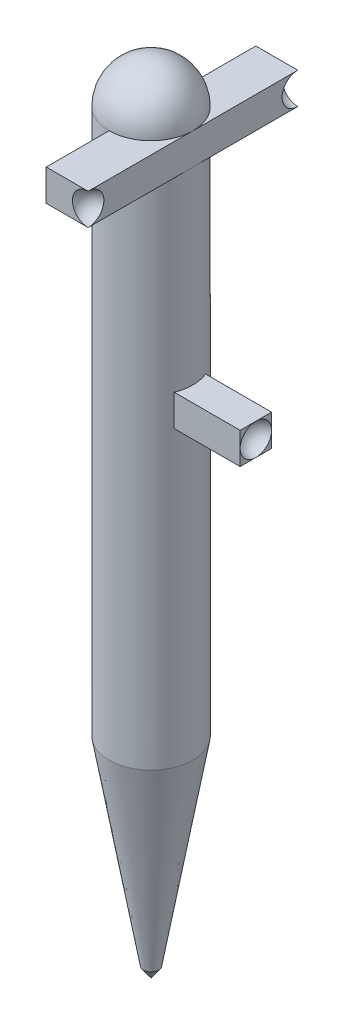
ISO-10303-21;
HEADER;
FILE_DESCRIPTION(('STEP AP214'),'2;1');
FILE_NAME('part.step','',(''),(''),'','','');
FILE_SCHEMA(('AUTOMOTIVE_DESIGN { 1 0 10303 214 1 1 1 1 }'));
ENDSEC;
DATA;
#1=APPLICATION_CONTEXT('core data for automotive mechanical design processes');
#2=APPLICATION_PROTOCOL_DEFINITION('international standard','automotive_design',2000,#1);
#3=PRODUCT_CONTEXT('',#1,'mechanical');
#4=PRODUCT('Part','Part','',(#3));
#5=PRODUCT_RELATED_PRODUCT_CATEGORY('part','',(#4));
#6=PRODUCT_DEFINITION_FORMATION('','',#4);
#7=PRODUCT_DEFINITION_CONTEXT('part definition',#1,'design');
#8=PRODUCT_DEFINITION('design','',#6,#7);
#9=PRODUCT_DEFINITION_SHAPE('','',#8);
#10=(LENGTH_UNIT() NAMED_UNIT(*) SI_UNIT(.MILLI.,.METRE.));
#11=(NAMED_UNIT(*) PLANE_ANGLE_UNIT() SI_UNIT($,.RADIAN.));
#12=(NAMED_UNIT(*) SI_UNIT($,.STERADIAN.) SOLID_ANGLE_UNIT());
#13=UNCERTAINTY_MEASURE_WITH_UNIT(LENGTH_MEASURE(1.E-05),#10,'distance_accuracy_value','');
#14=(GEOMETRIC_REPRESENTATION_CONTEXT(3) GLOBAL_UNCERTAINTY_ASSIGNED_CONTEXT((#13)) GLOBAL_UNIT_ASSIGNED_CONTEXT((#10,
#11,#12)) REPRESENTATION_CONTEXT('',''));
#15=CARTESIAN_POINT('',(0.,0.,0.));
#16=DIRECTION('',(0.,0.,1.));
#17=DIRECTION('',(1.,0.,0.));
#18=AXIS2_PLACEMENT_3D('',#15,#16,#17);
#19=CARTESIAN_POINT('',(127.,-266.7,19.05));
#20=DIRECTION('',(-1.,0.,0.));
#21=DIRECTION('',(0.,0.,1.));
#22=AXIS2_PLACEMENT_3D('',#19,#20,#21);
#23=PLANE('',#22);
#24=DIRECTION('',(0.,1.,0.));
#25=VECTOR('',#24,1.);
#26=CARTESIAN_POINT('',(127.,-266.7,19.05));
#27=LINE('',#26,#25);
#28=CARTESIAN_POINT('',(127.,-285.75,19.05));
#29=VERTEX_POINT('',#28);
#30=CARTESIAN_POINT('',(127.,-266.7,19.05));
#31=VERTEX_POINT('',#30);
#32=EDGE_CURVE('E274',#29,#31,#27,.T.);
#33=ORIENTED_EDGE('',*,*,#32,.F.);
#34=CARTESIAN_POINT('',(127.,-285.75,0.));
#35=DIRECTION('',(-1.,0.,0.));
#36=DIRECTION('',(0.,0.,1.));
#37=AXIS2_PLACEMENT_3D('',#34,#35,#36);
#38=CIRCLE('',#37,19.05);
#39=CARTESIAN_POINT('',(127.,-266.7,0.));
#40=VERTEX_POINT('',#39);
#41=EDGE_CURVE('E11',#29,#40,#38,.T.);
#42=ORIENTED_EDGE('',*,*,#41,.T.);
#43=DIRECTION('',(0.,0.,-1.));
#44=VECTOR('',#43,1.);
#45=CARTESIAN_POINT('',(127.,-266.7,19.05));
#46=LINE('',#45,#44);
#47=EDGE_CURVE('E150',#31,#40,#46,.T.);
#48=ORIENTED_EDGE('',*,*,#47,.F.);
#49=EDGE_LOOP('',(#33,#42,#48));
#50=FACE_BOUND('',#49,.T.);
#51=ADVANCED_FACE('F35',(#50),#23,.F.);
#52=CARTESIAN_POINT('',(127.,-266.7,-19.05));
#53=VERTEX_POINT('',#52);
#54=EDGE_CURVE('E275',#40,#53,#46,.T.);
#55=ORIENTED_EDGE('',*,*,#54,.F.);
#56=CARTESIAN_POINT('',(127.,-285.75,-19.05));
#57=VERTEX_POINT('',#56);
#58=EDGE_CURVE('E44',#40,#57,#38,.T.);
#59=ORIENTED_EDGE('',*,*,#58,.T.);
#60=DIRECTION('',(0.,1.,0.));
#61=VECTOR('',#60,1.);
#62=CARTESIAN_POINT('',(127.,-266.7,-19.05));
#63=LINE('',#62,#61);
#64=EDGE_CURVE('E277',#57,#53,#63,.T.);
#65=ORIENTED_EDGE('',*,*,#64,.T.);
#66=EDGE_LOOP('',(#55,#59,#65));
#67=FACE_BOUND('',#66,.T.);
#68=ADVANCED_FACE('F283',(#67),#23,.F.);
#69=CARTESIAN_POINT('',(127.,-304.8,-19.05));
#70=VERTEX_POINT('',#69);
#71=EDGE_CURVE('E144',#70,#57,#63,.T.);
#72=ORIENTED_EDGE('',*,*,#71,.T.);
#73=CARTESIAN_POINT('',(127.,-304.8,0.));
#74=VERTEX_POINT('',#73);
#75=EDGE_CURVE('E132',#57,#74,#38,.T.);
#76=ORIENTED_EDGE('',*,*,#75,.T.);
#77=DIRECTION('',(0.,0.,-1.));
#78=VECTOR('',#77,1.);
#79=CARTESIAN_POINT('',(127.,-304.8,19.05));
#80=LINE('',#79,#78);
#81=EDGE_CURVE('E143',#74,#70,#80,.T.);
#82=ORIENTED_EDGE('',*,*,#81,.T.);
#83=EDGE_LOOP('',(#72,#76,#82));
#84=FACE_BOUND('',#83,.T.);
#85=ADVANCED_FACE('F142',(#84),#23,.F.);
#86=CARTESIAN_POINT('',(0.,-914.4,0.));
#87=DIRECTION('',(0.,-1.,0.));
#88=DIRECTION('',(0.,0.,-1.));
#89=AXIS2_PLACEMENT_3D('',#86,#87,#88);
#90=CYLINDRICAL_SURFACE('',#89,50.8);
#91=DIRECTION('',(0.,-1.,0.));
#92=VECTOR('',#91,1.);
#93=CARTESIAN_POINT('',(47.0928603930575,-914.4,19.05));
#94=LINE('',#93,#92);
#95=CARTESIAN_POINT('',(47.0928603930575,-266.7,19.05));
#96=VERTEX_POINT('',#95);
#97=CARTESIAN_POINT('',(47.0928603930575,-304.8,19.05));
#98=VERTEX_POINT('',#97);
#99=EDGE_CURVE('E218',#96,#98,#94,.T.);
#100=ORIENTED_EDGE('',*,*,#99,.F.);
#101=CARTESIAN_POINT('',(0.,-266.7,0.));
#102=DIRECTION('',(0.,-1.,0.));
#103=DIRECTION('',(0.,0.,-1.));
#104=AXIS2_PLACEMENT_3D('',#101,#102,#103);
#105=CIRCLE('',#104,50.8);
#106=CARTESIAN_POINT('',(47.0928603930575,-266.7,-19.05));
#107=VERTEX_POINT('',#106);
#108=EDGE_CURVE('E215',#96,#107,#105,.F.);
#109=ORIENTED_EDGE('',*,*,#108,.T.);
#110=DIRECTION('',(0.,-1.,0.));
#111=VECTOR('',#110,1.);
#112=CARTESIAN_POINT('',(47.0928603930575,-914.4,-19.05));
#113=LINE('',#112,#111);
#114=CARTESIAN_POINT('',(47.0928603930575,-304.8,-19.05));
#115=VERTEX_POINT('',#114);
#116=EDGE_CURVE('E209',#107,#115,#113,.T.);
#117=ORIENTED_EDGE('',*,*,#116,.T.);
#118=CARTESIAN_POINT('',(0.,-304.8,0.));
#119=DIRECTION('',(0.,1.,0.));
#120=DIRECTION('',(0.,0.,1.));
#121=AXIS2_PLACEMENT_3D('',#118,#119,#120);
#122=CIRCLE('',#121,50.8);
#123=EDGE_CURVE('E212',#115,#98,#122,.F.);
#124=ORIENTED_EDGE('',*,*,#123,.T.);
#125=EDGE_LOOP('',(#100,#109,#117,#124));
#126=FACE_BOUND('',#125,.T.);
#127=CARTESIAN_POINT('',(0.,-660.4,0.));
#128=DIRECTION('',(0.,-1.,0.));
#129=DIRECTION('',(0.,0.,-1.));
#130=AXIS2_PLACEMENT_3D('',#127,#128,#129);
#131=CIRCLE('',#130,50.8000000000001);
#132=CARTESIAN_POINT('',(0.,-660.4,50.8000000000001));
#133=VERTEX_POINT('',#132);
#134=EDGE_CURVE('E194',#133,#133,#131,.T.);
#135=ORIENTED_EDGE('',*,*,#134,.F.);
#136=EDGE_LOOP('',(#135));
#137=FACE_BOUND('',#136,.T.);
#138=CARTESIAN_POINT('',(0.,0.,0.));
#139=DIRECTION('',(0.,-1.,0.));
#140=DIRECTION('',(0.,0.,-1.));
#141=AXIS2_PLACEMENT_3D('',#138,#139,#140);
#142=CIRCLE('',#141,50.8);
#143=CARTESIAN_POINT('',(0.,0.,50.8));
#144=VERTEX_POINT('',#143);
#145=CARTESIAN_POINT('',(0.,0.,-50.8));
#146=VERTEX_POINT('',#145);
#147=EDGE_CURVE('E197',#144,#146,#142,.T.);
#148=ORIENTED_EDGE('',*,*,#147,.T.);
#149=DIRECTION('',(0.,-1.,0.));
#150=VECTOR('',#149,1.);
#151=CARTESIAN_POINT('',(1.11981703314034E-13,-914.4,-50.8));
#152=LINE('',#151,#150);
#153=CARTESIAN_POINT('',(0.,-38.1,-50.8));
#154=VERTEX_POINT('',#153);
#155=EDGE_CURVE('E207',#146,#154,#152,.T.);
#156=ORIENTED_EDGE('',*,*,#155,.T.);
#157=CARTESIAN_POINT('',(0.,-38.1,0.));
#158=DIRECTION('',(0.,1.,0.));
#159=DIRECTION('',(0.,0.,1.));
#160=AXIS2_PLACEMENT_3D('',#157,#158,#159);
#161=CIRCLE('',#160,50.8);
#162=CARTESIAN_POINT('',(50.8000000000002,-38.1,0.));
#163=VERTEX_POINT('',#162);
#164=EDGE_CURVE('E205',#154,#163,#161,.F.);
#165=ORIENTED_EDGE('',*,*,#164,.T.);
#166=CARTESIAN_POINT('',(0.,-38.1,50.8));
#167=VERTEX_POINT('',#166);
#168=EDGE_CURVE('E201',#163,#167,#161,.F.);
#169=ORIENTED_EDGE('',*,*,#168,.T.);
#170=DIRECTION('',(0.,-1.,0.));
#171=VECTOR('',#170,1.);
#172=CARTESIAN_POINT('',(1.11981703314034E-13,-914.4,50.8));
#173=LINE('',#172,#171);
#174=EDGE_CURVE('E204',#167,#144,#173,.F.);
#175=ORIENTED_EDGE('',*,*,#174,.T.);
#176=EDGE_LOOP('',(#148,#156,#165,#169,#175));
#177=FACE_BOUND('',#176,.T.);
#178=ADVANCED_FACE('F291',(#126,#137,#177),#90,.T.);
#179=CARTESIAN_POINT('',(0.,0.,0.));
#180=DIRECTION('',(0.,-1.,0.));
#181=DIRECTION('',(1.,0.,0.));
#182=AXIS2_PLACEMENT_3D('',#179,#180,#181);
#183=SPHERICAL_SURFACE('',#182,50.8);
#184=CARTESIAN_POINT('',(50.8,0.,0.));
#185=VERTEX_POINT('',#184);
#186=EDGE_CURVE('E198',#146,#185,#142,.T.);
#187=ORIENTED_EDGE('',*,*,#186,.F.);
#188=ORIENTED_EDGE('',*,*,#147,.F.);
#189=EDGE_CURVE('E202',#185,#144,#142,.T.);
#190=ORIENTED_EDGE('',*,*,#189,.F.);
#191=EDGE_LOOP('',(#187,#188,#190));
#192=FACE_BOUND('',#191,.T.);
#193=ADVANCED_FACE('F37',(#192),#183,.T.);
#194=CARTESIAN_POINT('',(0.,-901.7,0.));
#195=DIRECTION('',(0.,1.,0.));
#196=DIRECTION('',(0.,0.,1.));
#197=AXIS2_PLACEMENT_3D('',#194,#195,#196);
#198=CONICAL_SURFACE('',#197,9.12084018619902,0.171039902752433);
#199=CARTESIAN_POINT('',(0.,-901.7,0.));
#200=DIRECTION('',(0.,-1.,0.));
#201=DIRECTION('',(0.,0.,-1.));
#202=AXIS2_PLACEMENT_3D('',#199,#200,#201);
#203=CIRCLE('',#202,9.12084018619902);
#204=CARTESIAN_POINT('',(0.,-901.7,9.12084018619903));
#205=VERTEX_POINT('',#204);
#206=EDGE_CURVE('E191',#205,#205,#203,.T.);
#207=CARTESIAN_POINT('',(0.,-660.4,50.8000000000001));
#208=CARTESIAN_POINT('',(0.,-662.913541666667,50.365842085273));
#209=CARTESIAN_POINT('',(0.,-665.427083333333,49.9316841705459));
#210=CARTESIAN_POINT('',(0.,-670.454166666667,49.0633683410917));
#211=CARTESIAN_POINT('',(0.,-672.967708333333,48.6292104263646));
#212=CARTESIAN_POINT('',(0.,-677.994791666667,47.7608945969104));
#213=CARTESIAN_POINT('',(0.,-680.508333333333,47.3267366821833));
#214=CARTESIAN_POINT('',(0.,-685.535416666667,46.4584208527291));
#215=CARTESIAN_POINT('',(0.,-688.048958333333,46.0242629380021));
#216=CARTESIAN_POINT('',(0.,-693.076041666667,45.1559471085479));
#217=CARTESIAN_POINT('',(0.,-695.589583333333,44.7217891938208));
#218=CARTESIAN_POINT('',(0.,-700.616666666667,43.8534733643666));
#219=CARTESIAN_POINT('',(0.,-703.130208333333,43.4193154496395));
#220=CARTESIAN_POINT('',(0.,-708.157291666667,42.5509996201853));
#221=CARTESIAN_POINT('',(0.,-710.670833333333,42.1168417054582));
#222=CARTESIAN_POINT('',(0.,-715.697916666667,41.248525876004));
#223=CARTESIAN_POINT('',(0.,-718.211458333333,40.8143679612769));
#224=CARTESIAN_POINT('',(0.,-723.238541666667,39.9460521318227));
#225=CARTESIAN_POINT('',(0.,-725.752083333333,39.5118942170956));
#226=CARTESIAN_POINT('',(0.,-730.779166666667,38.6435783876415));
#227=CARTESIAN_POINT('',(0.,-733.292708333333,38.2094204729144));
#228=CARTESIAN_POINT('',(0.,-738.319791666666,37.3411046434602));
#229=CARTESIAN_POINT('',(0.,-740.833333333333,36.9069467287331));
#230=CARTESIAN_POINT('',(0.,-745.860416666667,36.0386308992789));
#231=CARTESIAN_POINT('',(0.,-748.373958333333,35.6044729845518));
#232=CARTESIAN_POINT('',(0.,-753.401041666667,34.7361571550976));
#233=CARTESIAN_POINT('',(0.,-755.914583333333,34.3019992403705));
#234=CARTESIAN_POINT('',(0.,-760.941666666666,33.4336834109163));
#235=CARTESIAN_POINT('',(0.,-763.455208333333,32.9995254961892));
#236=CARTESIAN_POINT('',(0.,-768.482291666667,32.131209666735));
#237=CARTESIAN_POINT('',(0.,-770.995833333333,31.6970517520079));
#238=CARTESIAN_POINT('',(0.,-776.022916666667,30.8287359225538));
#239=CARTESIAN_POINT('',(0.,-778.536458333333,30.3945780078267));
#240=CARTESIAN_POINT('',(0.,-783.563541666667,29.5262621783725));
#241=CARTESIAN_POINT('',(0.,-786.077083333333,29.0921042636454));
#242=CARTESIAN_POINT('',(0.,-791.104166666667,28.2237884341912));
#243=CARTESIAN_POINT('',(0.,-793.617708333333,27.7896305194641));
#244=CARTESIAN_POINT('',(0.,-798.644791666667,26.9213146900099));
#245=CARTESIAN_POINT('',(0.,-801.158333333333,26.4871567752828));
#246=CARTESIAN_POINT('',(0.,-806.185416666667,25.6188409458286));
#247=CARTESIAN_POINT('',(0.,-808.698958333333,25.1846830311015));
#248=CARTESIAN_POINT('',(0.,-813.726041666667,24.3163672016473));
#249=CARTESIAN_POINT('',(0.,-816.239583333333,23.8822092869202));
#250=CARTESIAN_POINT('',(0.,-821.266666666667,23.0138934574661));
#251=CARTESIAN_POINT('',(0.,-823.780208333333,22.579735542739));
#252=CARTESIAN_POINT('',(0.,-828.807291666667,21.7114197132848));
#253=CARTESIAN_POINT('',(0.,-831.320833333333,21.2772617985577));
#254=CARTESIAN_POINT('',(0.,-836.347916666666,20.4089459691035));
#255=CARTESIAN_POINT('',(0.,-838.861458333333,19.9747880543764));
#256=CARTESIAN_POINT('',(0.,-843.888541666666,19.1064722249222));
#257=CARTESIAN_POINT('',(0.,-846.402083333333,18.6723143101951));
#258=CARTESIAN_POINT('',(0.,-851.429166666667,17.8039984807409));
#259=CARTESIAN_POINT('',(0.,-853.942708333333,17.3698405660138));
#260=CARTESIAN_POINT('',(0.,-858.969791666667,16.5015247365596));
#261=CARTESIAN_POINT('',(0.,-861.483333333333,16.0673668218325));
#262=CARTESIAN_POINT('',(0.,-866.510416666667,15.1990509923784));
#263=CARTESIAN_POINT('',(0.,-869.023958333333,14.7648930776513));
#264=CARTESIAN_POINT('',(0.,-874.051041666667,13.8965772481971));
#265=CARTESIAN_POINT('',(0.,-876.564583333333,13.46241933347));
#266=CARTESIAN_POINT('',(0.,-881.591666666667,12.5941035040158));
#267=CARTESIAN_POINT('',(0.,-884.105208333333,12.1599455892887));
#268=CARTESIAN_POINT('',(0.,-889.132291666667,11.2916297598345));
#269=CARTESIAN_POINT('',(0.,-891.645833333333,10.8574718451074));
#270=CARTESIAN_POINT('',(0.,-896.672916666667,9.98915601565322));
#271=CARTESIAN_POINT('',(0.,-899.186458333333,9.55499810092612));
#272=CARTESIAN_POINT('',(0.,-901.7,9.12084018619903));
#273=B_SPLINE_CURVE_WITH_KNOTS('',3,(#207,#208,#209,#210,#211,#212,#213,#214,#215,#216,#217,
#218,#219,#220,#221,#222,#223,#224,#225,#226,#227,#228,#229,#230,#231,#232,#233,#234,#235,#236,
#237,#238,#239,#240,#241,#242,#243,#244,#245,#246,#247,#248,#249,#250,#251,#252,#253,#254,#255,
#256,#257,#258,#259,#260,#261,#262,#263,#264,#265,#266,#267,#268,#269,#270,#271,#272),
.UNSPECIFIED.,.F.,.F.,(4,2,2,2,2,2,2,2,2,2,2,2,2,2,2,2,2,2,2,2,2,2,2,2,2,2,2,2,2,2,2,2,4),(0.,
7.65228483819753,15.304569676395,22.9568545145924,30.6091393527899,38.2614241909873,
45.9137090291848,53.5659938673823,61.2182787055797,68.8705635437771,76.5228483819745,
84.175133220172,91.8274180583695,99.4797028965669,107.131987734764,114.784272572962,
122.436557411159,130.088842249357,137.741127087554,145.393411925752,153.045696763949,
160.697981602147,168.350266440344,176.002551278541,183.654836116739,191.307120954936,
198.959405793134,206.611690631331,214.263975469529,221.916260307726,229.568545145923,
237.220829984121,244.873114822318),.UNSPECIFIED.);
#274=EDGE_CURVE('BSEAM317',#133,#205,#273,.T.);
#275=ORIENTED_EDGE('',*,*,#134,.T.);
#276=ORIENTED_EDGE('',*,*,#206,.F.);
#277=ORIENTED_EDGE('',*,*,#274,.T.);
#278=ORIENTED_EDGE('',*,*,#274,.F.);
#279=EDGE_LOOP('',(#275,#277,#276,#278));
#280=FACE_BOUND('',#279,.T.);
#281=ADVANCED_FACE('F317',(#280),#198,.T.);
#282=CARTESIAN_POINT('',(0.,-914.4,0.));
#283=DIRECTION('',(0.,1.,0.));
#284=DIRECTION('',(0.,0.,1.));
#285=AXIS2_PLACEMENT_3D('',#282,#283,#284);
#286=CONICAL_SURFACE('',#285,0.,0.622821008199919);
#287=ORIENTED_EDGE('',*,*,#206,.T.);
#288=EDGE_LOOP('',(#287));
#289=FACE_BOUND('',#288,.T.);
#290=CARTESIAN_POINT('',(0.,-914.4,0.));
#291=VERTEX_POINT('',#290);
#292=VERTEX_LOOP('',#291);
#293=FACE_BOUND('',#292,.T.);
#294=ADVANCED_FACE('F322',(#289,#293),#286,.T.);
#295=CARTESIAN_POINT('',(0.,0.,127.));
#296=DIRECTION('',(1.,0.,0.));
#297=DIRECTION('',(0.,1.,0.));
#298=AXIS2_PLACEMENT_3D('',#295,#296,#297);
#299=PLANE('',#298);
#300=ORIENTED_EDGE('',*,*,#174,.F.);
#301=DIRECTION('',(0.,0.,-1.));
#302=VECTOR('',#301,1.);
#303=CARTESIAN_POINT('',(0.,-38.1,127.));
#304=LINE('',#303,#302);
#305=CARTESIAN_POINT('',(0.,-38.1,127.));
#306=VERTEX_POINT('',#305);
#307=EDGE_CURVE('E188',#306,#167,#304,.T.);
#308=ORIENTED_EDGE('',*,*,#307,.F.);
#309=DIRECTION('',(0.,-1.,0.));
#310=VECTOR('',#309,1.);
#311=CARTESIAN_POINT('',(0.,0.,127.));
#312=LINE('',#311,#310);
#313=CARTESIAN_POINT('',(0.,0.,127.));
#314=VERTEX_POINT('',#313);
#315=EDGE_CURVE('E162',#314,#306,#312,.T.);
#316=ORIENTED_EDGE('',*,*,#315,.F.);
#317=DIRECTION('',(0.,0.,-1.));
#318=VECTOR('',#317,1.);
#319=CARTESIAN_POINT('',(0.,0.,127.));
#320=LINE('',#319,#318);
#321=EDGE_CURVE('E176',#314,#144,#320,.T.);
#322=ORIENTED_EDGE('',*,*,#321,.T.);
#323=EDGE_LOOP('',(#300,#308,#316,#322));
#324=FACE_BOUND('',#323,.T.);
#325=ADVANCED_FACE('F326',(#324),#299,.F.);
#326=CARTESIAN_POINT('',(0.,-38.1,127.));
#327=DIRECTION('',(0.,1.,0.));
#328=DIRECTION('',(0.,0.,1.));
#329=AXIS2_PLACEMENT_3D('',#326,#327,#328);
#330=PLANE('',#329);
#331=ORIENTED_EDGE('',*,*,#164,.F.);
#332=CARTESIAN_POINT('',(0.,-38.1,-127.));
#333=VERTEX_POINT('',#332);
#334=EDGE_CURVE('E187',#154,#333,#304,.T.);
#335=ORIENTED_EDGE('',*,*,#334,.T.);
#336=DIRECTION('',(1.,0.,0.));
#337=VECTOR('',#336,1.);
#338=CARTESIAN_POINT('',(0.,-38.1,-127.));
#339=LINE('',#338,#337);
#340=CARTESIAN_POINT('',(50.8,-38.1,-127.));
#341=VERTEX_POINT('',#340);
#342=EDGE_CURVE('E157',#333,#341,#339,.T.);
#343=ORIENTED_EDGE('',*,*,#342,.T.);
#344=DIRECTION('',(0.,0.,-1.));
#345=VECTOR('',#344,1.);
#346=CARTESIAN_POINT('',(50.8,-38.1,127.));
#347=LINE('',#346,#345);
#348=EDGE_CURVE('E183',#163,#341,#347,.T.);
#349=ORIENTED_EDGE('',*,*,#348,.F.);
#350=EDGE_LOOP('',(#331,#335,#343,#349));
#351=FACE_BOUND('',#350,.T.);
#352=ADVANCED_FACE('F240',(#351),#330,.F.);
#353=CARTESIAN_POINT('',(50.8,0.,127.));
#354=DIRECTION('',(-1.,0.,0.));
#355=DIRECTION('',(0.,-1.,0.));
#356=AXIS2_PLACEMENT_3D('',#353,#354,#355);
#357=PLANE('',#356);
#358=ORIENTED_EDGE('',*,*,#348,.T.);
#359=CARTESIAN_POINT('',(50.8,-19.05,-127.));
#360=DIRECTION('',(-1.,0.,0.));
#361=DIRECTION('',(0.,-1.,0.));
#362=AXIS2_PLACEMENT_3D('',#359,#360,#361);
#363=CIRCLE('',#362,19.05);
#364=CARTESIAN_POINT('',(50.8,0.,-127.));
#365=VERTEX_POINT('',#364);
#366=EDGE_CURVE('E234',#341,#365,#363,.T.);
#367=ORIENTED_EDGE('',*,*,#366,.T.);
#368=DIRECTION('',(0.,0.,-1.));
#369=VECTOR('',#368,1.);
#370=CARTESIAN_POINT('',(50.8,0.,127.));
#371=LINE('',#370,#369);
#372=EDGE_CURVE('E179',#185,#365,#371,.T.);
#373=ORIENTED_EDGE('',*,*,#372,.F.);
#374=CARTESIAN_POINT('',(50.8,0.,127.));
#375=VERTEX_POINT('',#374);
#376=EDGE_CURVE('E180',#375,#185,#371,.T.);
#377=ORIENTED_EDGE('',*,*,#376,.F.);
#378=CARTESIAN_POINT('',(50.8,-19.05,127.));
#379=DIRECTION('',(-1.,0.,0.));
#380=DIRECTION('',(0.,-1.,0.));
#381=AXIS2_PLACEMENT_3D('',#378,#379,#380);
#382=CIRCLE('',#381,19.05);
#383=CARTESIAN_POINT('',(50.8,-38.1,127.));
#384=VERTEX_POINT('',#383);
#385=EDGE_CURVE('E262',#375,#384,#382,.T.);
#386=ORIENTED_EDGE('',*,*,#385,.T.);
#387=EDGE_CURVE('E184',#384,#163,#347,.T.);
#388=ORIENTED_EDGE('',*,*,#387,.T.);
#389=EDGE_LOOP('',(#358,#367,#373,#377,#386,#388));
#390=FACE_BOUND('',#389,.T.);
#391=ADVANCED_FACE('F232',(#390),#357,.F.);
#392=CARTESIAN_POINT('',(0.,0.,127.));
#393=DIRECTION('',(0.,-1.,0.));
#394=DIRECTION('',(0.,0.,-1.));
#395=AXIS2_PLACEMENT_3D('',#392,#393,#394);
#396=PLANE('',#395);
#397=ORIENTED_EDGE('',*,*,#189,.T.);
#398=ORIENTED_EDGE('',*,*,#321,.F.);
#399=DIRECTION('',(-1.,0.,0.));
#400=VECTOR('',#399,1.);
#401=CARTESIAN_POINT('',(0.,0.,127.));
#402=LINE('',#401,#400);
#403=EDGE_CURVE('E169',#375,#314,#402,.T.);
#404=ORIENTED_EDGE('',*,*,#403,.F.);
#405=ORIENTED_EDGE('',*,*,#376,.T.);
#406=EDGE_LOOP('',(#397,#398,#404,#405));
#407=FACE_BOUND('',#406,.T.);
#408=ADVANCED_FACE('F253',(#407),#396,.F.);
#409=ORIENTED_EDGE('',*,*,#155,.F.);
#410=CARTESIAN_POINT('',(0.,0.,-127.));
#411=VERTEX_POINT('',#410);
#412=EDGE_CURVE('E170',#146,#411,#320,.T.);
#413=ORIENTED_EDGE('',*,*,#412,.T.);
#414=DIRECTION('',(0.,-1.,0.));
#415=VECTOR('',#414,1.);
#416=CARTESIAN_POINT('',(0.,0.,-127.));
#417=LINE('',#416,#415);
#418=EDGE_CURVE('E155',#411,#333,#417,.T.);
#419=ORIENTED_EDGE('',*,*,#418,.T.);
#420=ORIENTED_EDGE('',*,*,#334,.F.);
#421=EDGE_LOOP('',(#409,#413,#419,#420));
#422=FACE_BOUND('',#421,.T.);
#423=ADVANCED_FACE('F244',(#422),#299,.F.);
#424=ORIENTED_EDGE('',*,*,#168,.F.);
#425=ORIENTED_EDGE('',*,*,#387,.F.);
#426=DIRECTION('',(1.,0.,0.));
#427=VECTOR('',#426,1.);
#428=CARTESIAN_POINT('',(0.,-38.1,127.));
#429=LINE('',#428,#427);
#430=EDGE_CURVE('E165',#306,#384,#429,.T.);
#431=ORIENTED_EDGE('',*,*,#430,.F.);
#432=ORIENTED_EDGE('',*,*,#307,.T.);
#433=EDGE_LOOP('',(#424,#425,#431,#432));
#434=FACE_BOUND('',#433,.T.);
#435=ADVANCED_FACE('F330',(#434),#330,.F.);
#436=ORIENTED_EDGE('',*,*,#186,.T.);
#437=ORIENTED_EDGE('',*,*,#372,.T.);
#438=DIRECTION('',(-1.,0.,0.));
#439=VECTOR('',#438,1.);
#440=CARTESIAN_POINT('',(0.,0.,-127.));
#441=LINE('',#440,#439);
#442=EDGE_CURVE('E166',#365,#411,#441,.T.);
#443=ORIENTED_EDGE('',*,*,#442,.T.);
#444=ORIENTED_EDGE('',*,*,#412,.F.);
#445=EDGE_LOOP('',(#436,#437,#443,#444));
#446=FACE_BOUND('',#445,.T.);
#447=ADVANCED_FACE('F247',(#446),#396,.F.);
#448=CARTESIAN_POINT('',(0.,0.,127.));
#449=DIRECTION('',(0.,0.,1.));
#450=DIRECTION('',(1.,0.,0.));
#451=AXIS2_PLACEMENT_3D('',#448,#449,#450);
#452=PLANE('',#451);
#453=CARTESIAN_POINT('',(50.8,-19.05,127.));
#454=DIRECTION('',(0.,0.,1.));
#455=DIRECTION('',(1.,0.,0.));
#456=AXIS2_PLACEMENT_3D('',#453,#454,#455);
#457=CIRCLE('',#456,19.05);
#458=EDGE_CURVE('E220',#375,#384,#457,.T.);
#459=ORIENTED_EDGE('',*,*,#458,.F.);
#460=ORIENTED_EDGE('',*,*,#403,.T.);
#461=ORIENTED_EDGE('',*,*,#315,.T.);
#462=ORIENTED_EDGE('',*,*,#430,.T.);
#463=EDGE_LOOP('',(#459,#460,#461,#462));
#464=FACE_BOUND('',#463,.T.);
#465=ADVANCED_FACE('F258',(#464),#452,.T.);
#466=CARTESIAN_POINT('',(0.,0.,-127.));
#467=DIRECTION('',(0.,0.,1.));
#468=DIRECTION('',(1.,0.,0.));
#469=AXIS2_PLACEMENT_3D('',#466,#467,#468);
#470=PLANE('',#469);
#471=ORIENTED_EDGE('',*,*,#442,.F.);
#472=CARTESIAN_POINT('',(50.8,-19.05,-127.));
#473=DIRECTION('',(0.,0.,1.));
#474=DIRECTION('',(1.,0.,0.));
#475=AXIS2_PLACEMENT_3D('',#472,#473,#474);
#476=CIRCLE('',#475,19.05);
#477=EDGE_CURVE('E138',#365,#341,#476,.T.);
#478=ORIENTED_EDGE('',*,*,#477,.T.);
#479=ORIENTED_EDGE('',*,*,#342,.F.);
#480=ORIENTED_EDGE('',*,*,#418,.F.);
#481=EDGE_LOOP('',(#471,#478,#479,#480));
#482=FACE_BOUND('',#481,.T.);
#483=ADVANCED_FACE('F226',(#482),#470,.F.);
#484=CARTESIAN_POINT('',(127.,-266.7,19.05));
#485=DIRECTION('',(0.,-1.,0.));
#486=DIRECTION('',(0.,0.,-1.));
#487=AXIS2_PLACEMENT_3D('',#484,#485,#486);
#488=PLANE('',#487);
#489=ORIENTED_EDGE('',*,*,#108,.F.);
#490=DIRECTION('',(-1.,0.,0.));
#491=VECTOR('',#490,1.);
#492=CARTESIAN_POINT('',(127.,-266.7,19.05));
#493=LINE('',#492,#491);
#494=EDGE_CURVE('E269',#31,#96,#493,.T.);
#495=ORIENTED_EDGE('',*,*,#494,.F.);
#496=ORIENTED_EDGE('',*,*,#47,.T.);
#497=ORIENTED_EDGE('',*,*,#54,.T.);
#498=DIRECTION('',(-1.,0.,0.));
#499=VECTOR('',#498,1.);
#500=CARTESIAN_POINT('',(127.,-266.7,-19.05));
#501=LINE('',#500,#499);
#502=EDGE_CURVE('E263',#53,#107,#501,.T.);
#503=ORIENTED_EDGE('',*,*,#502,.T.);
#504=EDGE_LOOP('',(#489,#495,#496,#497,#503));
#505=FACE_BOUND('',#504,.T.);
#506=ADVANCED_FACE('F287',(#505),#488,.F.);
#507=CARTESIAN_POINT('',(0.,-304.8,19.05));
#508=DIRECTION('',(0.,1.,0.));
#509=DIRECTION('',(0.,0.,1.));
#510=AXIS2_PLACEMENT_3D('',#507,#508,#509);
#511=PLANE('',#510);
#512=ORIENTED_EDGE('',*,*,#123,.F.);
#513=DIRECTION('',(1.,0.,0.));
#514=VECTOR('',#513,1.);
#515=CARTESIAN_POINT('',(0.,-304.8,-19.05));
#516=LINE('',#515,#514);
#517=EDGE_CURVE('E57',#115,#70,#516,.T.);
#518=ORIENTED_EDGE('',*,*,#517,.T.);
#519=ORIENTED_EDGE('',*,*,#81,.F.);
#520=CARTESIAN_POINT('',(127.,-304.8,19.05));
#521=VERTEX_POINT('',#520);
#522=EDGE_CURVE('E149',#521,#74,#80,.T.);
#523=ORIENTED_EDGE('',*,*,#522,.F.);
#524=DIRECTION('',(1.,0.,0.));
#525=VECTOR('',#524,1.);
#526=CARTESIAN_POINT('',(0.,-304.8,19.05));
#527=LINE('',#526,#525);
#528=EDGE_CURVE('E272',#98,#521,#527,.T.);
#529=ORIENTED_EDGE('',*,*,#528,.F.);
#530=EDGE_LOOP('',(#512,#518,#519,#523,#529));
#531=FACE_BOUND('',#530,.T.);
#532=ADVANCED_FACE('F147',(#531),#511,.F.);
#533=ORIENTED_EDGE('',*,*,#522,.T.);
#534=EDGE_CURVE('E39',#74,#29,#38,.T.);
#535=ORIENTED_EDGE('',*,*,#534,.T.);
#536=EDGE_CURVE('E154',#521,#29,#27,.T.);
#537=ORIENTED_EDGE('',*,*,#536,.F.);
#538=EDGE_LOOP('',(#533,#535,#537));
#539=FACE_BOUND('',#538,.T.);
#540=ADVANCED_FACE('F152',(#539),#23,.F.);
#541=CARTESIAN_POINT('',(0.,0.,19.05));
#542=DIRECTION('',(0.,0.,1.));
#543=DIRECTION('',(1.,0.,0.));
#544=AXIS2_PLACEMENT_3D('',#541,#542,#543);
#545=PLANE('',#544);
#546=ORIENTED_EDGE('',*,*,#494,.T.);
#547=ORIENTED_EDGE('',*,*,#99,.T.);
#548=ORIENTED_EDGE('',*,*,#528,.T.);
#549=ORIENTED_EDGE('',*,*,#536,.T.);
#550=ORIENTED_EDGE('',*,*,#32,.T.);
#551=EDGE_LOOP('',(#546,#547,#548,#549,#550));
#552=FACE_BOUND('',#551,.T.);
#553=ADVANCED_FACE('F294',(#552),#545,.T.);
#554=CARTESIAN_POINT('',(0.,0.,-19.05));
#555=DIRECTION('',(0.,0.,1.));
#556=DIRECTION('',(1.,0.,0.));
#557=AXIS2_PLACEMENT_3D('',#554,#555,#556);
#558=PLANE('',#557);
#559=ORIENTED_EDGE('',*,*,#116,.F.);
#560=ORIENTED_EDGE('',*,*,#502,.F.);
#561=ORIENTED_EDGE('',*,*,#64,.F.);
#562=ORIENTED_EDGE('',*,*,#71,.F.);
#563=ORIENTED_EDGE('',*,*,#517,.F.);
#564=EDGE_LOOP('',(#559,#560,#561,#562,#563));
#565=FACE_BOUND('',#564,.T.);
#566=ADVANCED_FACE('F285',(#565),#558,.F.);
#567=CARTESIAN_POINT('',(50.8,-19.05,127.));
#568=DIRECTION('',(0.,1.,0.));
#569=DIRECTION('',(-1.,0.,0.));
#570=AXIS2_PLACEMENT_3D('',#567,#568,#569);
#571=SPHERICAL_SURFACE('',#570,19.05);
#572=ORIENTED_EDGE('',*,*,#458,.T.);
#573=ORIENTED_EDGE('',*,*,#385,.F.);
#574=EDGE_LOOP('',(#572,#573));
#575=FACE_BOUND('',#574,.T.);
#576=ADVANCED_FACE('F261',(#575),#571,.F.);
#577=CARTESIAN_POINT('',(50.8,-19.05,-127.));
#578=DIRECTION('',(0.,1.,0.));
#579=DIRECTION('',(-1.,0.,0.));
#580=AXIS2_PLACEMENT_3D('',#577,#578,#579);
#581=SPHERICAL_SURFACE('',#580,19.05);
#582=ORIENTED_EDGE('',*,*,#477,.F.);
#583=ORIENTED_EDGE('',*,*,#366,.F.);
#584=EDGE_LOOP('',(#582,#583));
#585=FACE_BOUND('',#584,.T.);
#586=ADVANCED_FACE('F378',(#585),#581,.F.);
#587=CARTESIAN_POINT('',(127.,-285.75,0.));
#588=DIRECTION('',(0.,1.,0.));
#589=DIRECTION('',(1.,0.,0.));
#590=AXIS2_PLACEMENT_3D('',#587,#588,#589);
#591=SPHERICAL_SURFACE('',#590,19.05);
#592=CARTESIAN_POINT('',(127.,-285.75,0.));
#593=DIRECTION('',(-1.,0.,0.));
#594=DIRECTION('',(0.,0.,1.));
#595=AXIS2_PLACEMENT_3D('',#592,#593,#594);
#596=SPHERICAL_SURFACE('',#595,19.05);
#597=ORIENTED_EDGE('',*,*,#534,.F.);
#598=ORIENTED_EDGE('',*,*,#75,.F.);
#599=ORIENTED_EDGE('',*,*,#58,.F.);
#600=ORIENTED_EDGE('',*,*,#41,.F.);
#601=EDGE_LOOP('',(#597,#598,#599,#600));
#602=FACE_BOUND('',#601,.T.);
#603=ADVANCED_FACE('F131',(#602),#596,.F.);
#604=CLOSED_SHELL('',(#51,#68,#85,#178,#193,#281,#294,#325,#352,#391,#408,#423,#435,#447,#465,
#483,#506,#532,#540,#553,#566,#576,#586,#603));
#605=MANIFOLD_SOLID_BREP('B2',#604);
#606=ADVANCED_BREP_SHAPE_REPRESENTATION('',(#18,#605),#14);
#607=SHAPE_DEFINITION_REPRESENTATION(#9,#606);
ENDSEC;
END-ISO-10303-21;
